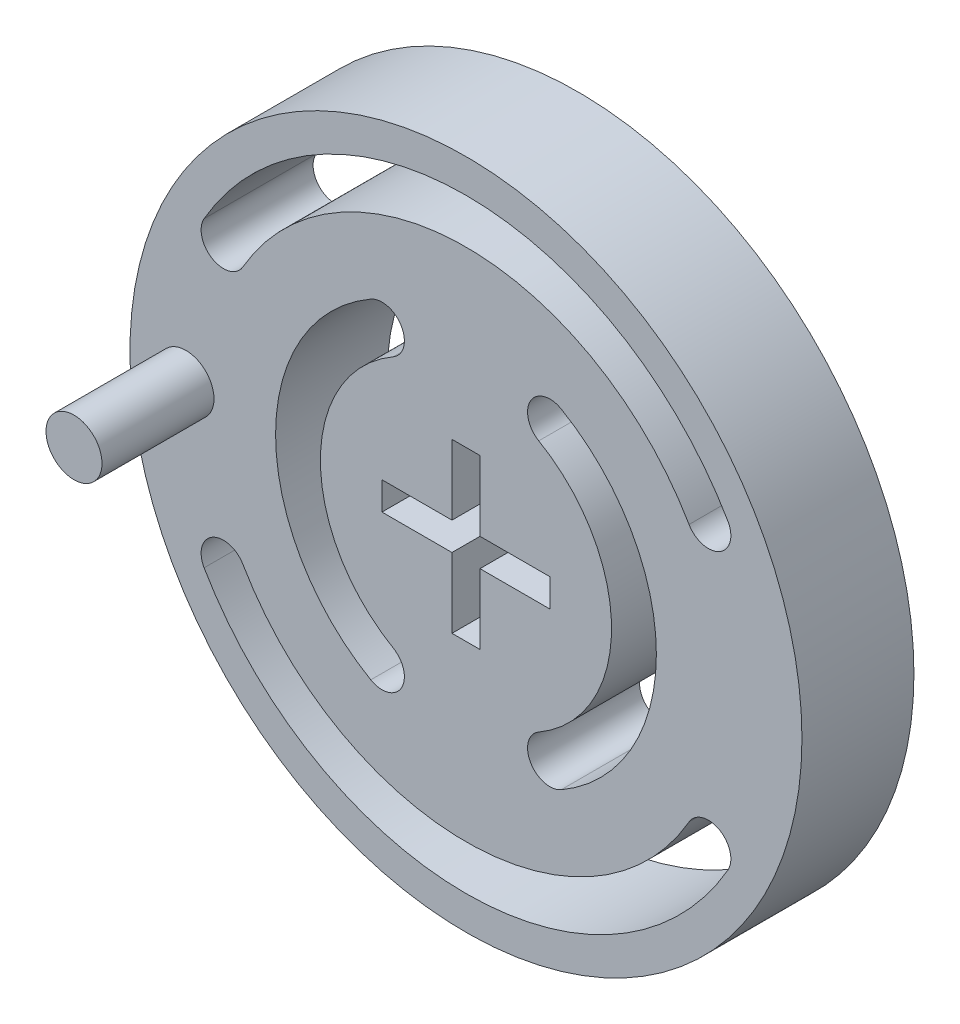
ISO-10303-21;
HEADER;
FILE_DESCRIPTION(('STEP AP214'),'2;1');
FILE_NAME('part.step','',(''),(''),'','','');
FILE_SCHEMA(('AUTOMOTIVE_DESIGN { 1 0 10303 214 1 1 1 1 }'));
ENDSEC;
DATA;
#1=APPLICATION_CONTEXT('core data for automotive mechanical design processes');
#2=APPLICATION_PROTOCOL_DEFINITION('international standard','automotive_design',2000,#1);
#3=PRODUCT_CONTEXT('',#1,'mechanical');
#4=PRODUCT('Part','Part','',(#3));
#5=PRODUCT_RELATED_PRODUCT_CATEGORY('part','',(#4));
#6=PRODUCT_DEFINITION_FORMATION('','',#4);
#7=PRODUCT_DEFINITION_CONTEXT('part definition',#1,'design');
#8=PRODUCT_DEFINITION('design','',#6,#7);
#9=PRODUCT_DEFINITION_SHAPE('','',#8);
#10=(LENGTH_UNIT() NAMED_UNIT(*) SI_UNIT(.MILLI.,.METRE.));
#11=(NAMED_UNIT(*) PLANE_ANGLE_UNIT() SI_UNIT($,.RADIAN.));
#12=(NAMED_UNIT(*) SI_UNIT($,.STERADIAN.) SOLID_ANGLE_UNIT());
#13=UNCERTAINTY_MEASURE_WITH_UNIT(LENGTH_MEASURE(1.E-05),#10,'distance_accuracy_value','');
#14=(GEOMETRIC_REPRESENTATION_CONTEXT(3) GLOBAL_UNCERTAINTY_ASSIGNED_CONTEXT((#13)) GLOBAL_UNIT_ASSIGNED_CONTEXT((#10,
#11,#12)) REPRESENTATION_CONTEXT('',''));
#15=CARTESIAN_POINT('',(0.,0.,0.));
#16=DIRECTION('',(0.,0.,1.));
#17=DIRECTION('',(1.,0.,0.));
#18=AXIS2_PLACEMENT_3D('',#15,#16,#17);
#19=CARTESIAN_POINT('',(0.,0.,10.));
#20=DIRECTION('',(0.,0.,-1.));
#21=DIRECTION('',(-1.,0.,0.));
#22=AXIS2_PLACEMENT_3D('',#19,#20,#21);
#23=CYLINDRICAL_SURFACE('',#22,30.);
#24=CARTESIAN_POINT('',(0.,0.,10.));
#25=DIRECTION('',(0.,0.,1.));
#26=DIRECTION('',(1.,0.,0.));
#27=AXIS2_PLACEMENT_3D('',#24,#25,#26);
#28=CIRCLE('',#27,30.);
#29=CARTESIAN_POINT('',(30.,0.,10.));
#30=VERTEX_POINT('',#29);
#31=EDGE_CURVE('E412',#30,#30,#28,.T.);
#32=ORIENTED_EDGE('',*,*,#31,.F.);
#33=EDGE_LOOP('',(#32));
#34=FACE_BOUND('',#33,.T.);
#35=CARTESIAN_POINT('',(0.,0.,0.));
#36=DIRECTION('',(0.,0.,1.));
#37=DIRECTION('',(1.,0.,0.));
#38=AXIS2_PLACEMENT_3D('',#35,#36,#37);
#39=CIRCLE('',#38,30.);
#40=CARTESIAN_POINT('',(30.,0.,0.));
#41=VERTEX_POINT('',#40);
#42=EDGE_CURVE('E409',#41,#41,#39,.T.);
#43=ORIENTED_EDGE('',*,*,#42,.T.);
#44=EDGE_LOOP('',(#43));
#45=FACE_BOUND('',#44,.T.);
#46=ADVANCED_FACE('F38',(#34,#45),#23,.T.);
#47=CARTESIAN_POINT('',(0.,0.,10.));
#48=DIRECTION('',(0.,0.,1.));
#49=DIRECTION('',(1.,0.,0.));
#50=AXIS2_PLACEMENT_3D('',#47,#48,#49);
#51=PLANE('',#50);
#52=CARTESIAN_POINT('',(-7.49999999999997,12.9903810567666,10.));
#53=DIRECTION('',(0.,0.,1.));
#54=DIRECTION('',(1.,0.,0.));
#55=AXIS2_PLACEMENT_3D('',#52,#53,#54);
#56=CIRCLE('',#55,2.);
#57=CARTESIAN_POINT('',(-6.49999999999997,11.2583302491977,10.));
#58=VERTEX_POINT('',#57);
#59=CARTESIAN_POINT('',(-8.49999999999997,14.7224318643355,10.));
#60=VERTEX_POINT('',#59);
#61=EDGE_CURVE('E52',#58,#60,#56,.T.);
#62=ORIENTED_EDGE('',*,*,#61,.F.);
#63=CARTESIAN_POINT('',(0.,0.,10.));
#64=DIRECTION('',(0.,0.,-1.));
#65=DIRECTION('',(1.,0.,0.));
#66=AXIS2_PLACEMENT_3D('',#63,#64,#65);
#67=CIRCLE('',#66,13.);
#68=CARTESIAN_POINT('',(-6.49999999999997,-11.2583302491977,10.));
#69=VERTEX_POINT('',#68);
#70=EDGE_CURVE('E266',#69,#58,#67,.T.);
#71=ORIENTED_EDGE('',*,*,#70,.F.);
#72=CARTESIAN_POINT('',(-7.49999999999996,-12.9903810567666,10.));
#73=DIRECTION('',(0.,0.,1.));
#74=DIRECTION('',(1.,0.,0.));
#75=AXIS2_PLACEMENT_3D('',#72,#73,#74);
#76=CIRCLE('',#75,2.);
#77=CARTESIAN_POINT('',(-8.49999999999996,-14.7224318643355,10.));
#78=VERTEX_POINT('',#77);
#79=EDGE_CURVE('E263',#78,#69,#76,.T.);
#80=ORIENTED_EDGE('',*,*,#79,.F.);
#81=CARTESIAN_POINT('',(0.,0.,10.));
#82=DIRECTION('',(0.,0.,1.));
#83=DIRECTION('',(1.,0.,0.));
#84=AXIS2_PLACEMENT_3D('',#81,#82,#83);
#85=CIRCLE('',#84,17.);
#86=EDGE_CURVE('E260',#60,#78,#85,.T.);
#87=ORIENTED_EDGE('',*,*,#86,.F.);
#88=EDGE_LOOP('',(#62,#71,#80,#87));
#89=FACE_BOUND('',#88,.T.);
#90=CARTESIAN_POINT('',(21.650635094611,-12.5,10.));
#91=DIRECTION('',(0.,0.,1.));
#92=DIRECTION('',(-1.,0.,0.));
#93=AXIS2_PLACEMENT_3D('',#90,#91,#92);
#94=CIRCLE('',#93,2.);
#95=CARTESIAN_POINT('',(23.3826859021799,-13.5,10.));
#96=VERTEX_POINT('',#95);
#97=CARTESIAN_POINT('',(19.9185842870421,-11.5,10.));
#98=VERTEX_POINT('',#97);
#99=EDGE_CURVE('E60',#96,#98,#94,.T.);
#100=ORIENTED_EDGE('',*,*,#99,.F.);
#101=CARTESIAN_POINT('',(0.,0.,10.));
#102=DIRECTION('',(0.,0.,1.));
#103=DIRECTION('',(-1.,0.,0.));
#104=AXIS2_PLACEMENT_3D('',#101,#102,#103);
#105=CIRCLE('',#104,27.);
#106=CARTESIAN_POINT('',(-23.3826859021799,-13.4999999999999,10.));
#107=VERTEX_POINT('',#106);
#108=EDGE_CURVE('E284',#107,#96,#105,.T.);
#109=ORIENTED_EDGE('',*,*,#108,.F.);
#110=CARTESIAN_POINT('',(-21.650635094611,-12.4999999999999,10.));
#111=DIRECTION('',(0.,0.,1.));
#112=DIRECTION('',(-1.,0.,0.));
#113=AXIS2_PLACEMENT_3D('',#110,#111,#112);
#114=CIRCLE('',#113,2.);
#115=CARTESIAN_POINT('',(-19.9185842870421,-11.5,10.));
#116=VERTEX_POINT('',#115);
#117=EDGE_CURVE('E281',#116,#107,#114,.T.);
#118=ORIENTED_EDGE('',*,*,#117,.F.);
#119=CARTESIAN_POINT('',(0.,0.,10.));
#120=DIRECTION('',(0.,0.,-1.));
#121=DIRECTION('',(-1.,0.,0.));
#122=AXIS2_PLACEMENT_3D('',#119,#120,#121);
#123=CIRCLE('',#122,23.);
#124=EDGE_CURVE('E278',#98,#116,#123,.T.);
#125=ORIENTED_EDGE('',*,*,#124,.F.);
#126=EDGE_LOOP('',(#100,#109,#118,#125));
#127=FACE_BOUND('',#126,.T.);
#128=CARTESIAN_POINT('',(7.49999999999997,12.9903810567666,10.));
#129=DIRECTION('',(0.,0.,1.));
#130=DIRECTION('',(-1.,0.,0.));
#131=AXIS2_PLACEMENT_3D('',#128,#129,#130);
#132=CIRCLE('',#131,2.);
#133=CARTESIAN_POINT('',(8.49999999999997,14.7224318643355,10.));
#134=VERTEX_POINT('',#133);
#135=CARTESIAN_POINT('',(6.49999999999998,11.2583302491977,10.));
#136=VERTEX_POINT('',#135);
#137=EDGE_CURVE('E245',#134,#136,#132,.T.);
#138=ORIENTED_EDGE('',*,*,#137,.F.);
#139=CARTESIAN_POINT('',(0.,0.,10.));
#140=DIRECTION('',(0.,0.,1.));
#141=DIRECTION('',(-1.,0.,0.));
#142=AXIS2_PLACEMENT_3D('',#139,#140,#141);
#143=CIRCLE('',#142,17.);
#144=CARTESIAN_POINT('',(8.49999999999996,-14.7224318643355,10.));
#145=VERTEX_POINT('',#144);
#146=EDGE_CURVE('E250',#145,#134,#143,.T.);
#147=ORIENTED_EDGE('',*,*,#146,.F.);
#148=CARTESIAN_POINT('',(7.49999999999996,-12.9903810567666,10.));
#149=DIRECTION('',(0.,0.,1.));
#150=DIRECTION('',(-1.,0.,0.));
#151=AXIS2_PLACEMENT_3D('',#148,#149,#150);
#152=CIRCLE('',#151,2.);
#153=CARTESIAN_POINT('',(6.49999999999997,-11.2583302491977,10.));
#154=VERTEX_POINT('',#153);
#155=EDGE_CURVE('E229',#154,#145,#152,.T.);
#156=ORIENTED_EDGE('',*,*,#155,.F.);
#157=CARTESIAN_POINT('',(0.,0.,10.));
#158=DIRECTION('',(0.,0.,-1.));
#159=DIRECTION('',(-1.,0.,0.));
#160=AXIS2_PLACEMENT_3D('',#157,#158,#159);
#161=CIRCLE('',#160,13.);
#162=EDGE_CURVE('E240',#136,#154,#161,.T.);
#163=ORIENTED_EDGE('',*,*,#162,.F.);
#164=EDGE_LOOP('',(#138,#147,#156,#163));
#165=FACE_BOUND('',#164,.T.);
#166=CARTESIAN_POINT('',(21.650635094611,12.5,10.));
#167=DIRECTION('',(0.,0.,1.));
#168=DIRECTION('',(1.,0.,0.));
#169=AXIS2_PLACEMENT_3D('',#166,#167,#168);
#170=CIRCLE('',#169,2.);
#171=CARTESIAN_POINT('',(19.9185842870421,11.5,10.));
#172=VERTEX_POINT('',#171);
#173=CARTESIAN_POINT('',(23.3826859021799,13.5,10.));
#174=VERTEX_POINT('',#173);
#175=EDGE_CURVE('E290',#172,#174,#170,.T.);
#176=ORIENTED_EDGE('',*,*,#175,.F.);
#177=CARTESIAN_POINT('',(0.,0.,10.));
#178=DIRECTION('',(0.,0.,-1.));
#179=DIRECTION('',(1.,0.,0.));
#180=AXIS2_PLACEMENT_3D('',#177,#178,#179);
#181=CIRCLE('',#180,23.);
#182=CARTESIAN_POINT('',(-19.9185842870421,11.5,10.));
#183=VERTEX_POINT('',#182);
#184=EDGE_CURVE('E303',#183,#172,#181,.T.);
#185=ORIENTED_EDGE('',*,*,#184,.F.);
#186=CARTESIAN_POINT('',(-21.650635094611,12.4999999999999,10.));
#187=DIRECTION('',(0.,0.,1.));
#188=DIRECTION('',(1.,0.,0.));
#189=AXIS2_PLACEMENT_3D('',#186,#187,#188);
#190=CIRCLE('',#189,2.);
#191=CARTESIAN_POINT('',(-23.3826859021799,13.4999999999999,10.));
#192=VERTEX_POINT('',#191);
#193=EDGE_CURVE('E300',#192,#183,#190,.T.);
#194=ORIENTED_EDGE('',*,*,#193,.F.);
#195=CARTESIAN_POINT('',(0.,0.,10.));
#196=DIRECTION('',(0.,0.,1.));
#197=DIRECTION('',(1.,0.,0.));
#198=AXIS2_PLACEMENT_3D('',#195,#196,#197);
#199=CIRCLE('',#198,27.);
#200=EDGE_CURVE('E297',#174,#192,#199,.T.);
#201=ORIENTED_EDGE('',*,*,#200,.F.);
#202=EDGE_LOOP('',(#176,#185,#194,#201));
#203=FACE_BOUND('',#202,.T.);
#204=DIRECTION('',(0.,-1.,0.));
#205=VECTOR('',#204,1.);
#206=CARTESIAN_POINT('',(-1.25,0.,10.));
#207=LINE('',#206,#205);
#208=CARTESIAN_POINT('',(-1.25,7.5,10.));
#209=VERTEX_POINT('',#208);
#210=CARTESIAN_POINT('',(-1.25,1.25,10.));
#211=VERTEX_POINT('',#210);
#212=EDGE_CURVE('E309',#209,#211,#207,.T.);
#213=ORIENTED_EDGE('',*,*,#212,.F.);
#214=DIRECTION('',(1.,0.,0.));
#215=VECTOR('',#214,1.);
#216=CARTESIAN_POINT('',(0.,7.5,10.));
#217=LINE('',#216,#215);
#218=CARTESIAN_POINT('',(1.25,7.5,10.));
#219=VERTEX_POINT('',#218);
#220=EDGE_CURVE('E320',#209,#219,#217,.T.);
#221=ORIENTED_EDGE('',*,*,#220,.T.);
#222=DIRECTION('',(0.,-1.,0.));
#223=VECTOR('',#222,1.);
#224=CARTESIAN_POINT('',(1.25,0.,10.));
#225=LINE('',#224,#223);
#226=CARTESIAN_POINT('',(1.25,1.25,10.));
#227=VERTEX_POINT('',#226);
#228=EDGE_CURVE('E376',#219,#227,#225,.T.);
#229=ORIENTED_EDGE('',*,*,#228,.T.);
#230=DIRECTION('',(1.,0.,0.));
#231=VECTOR('',#230,1.);
#232=CARTESIAN_POINT('',(0.,1.25,10.));
#233=LINE('',#232,#231);
#234=CARTESIAN_POINT('',(7.5,1.25,10.));
#235=VERTEX_POINT('',#234);
#236=EDGE_CURVE('E373',#227,#235,#233,.T.);
#237=ORIENTED_EDGE('',*,*,#236,.T.);
#238=DIRECTION('',(0.,-1.,0.));
#239=VECTOR('',#238,1.);
#240=CARTESIAN_POINT('',(7.5,0.,10.));
#241=LINE('',#240,#239);
#242=CARTESIAN_POINT('',(7.5,-1.25,10.));
#243=VERTEX_POINT('',#242);
#244=EDGE_CURVE('E370',#235,#243,#241,.T.);
#245=ORIENTED_EDGE('',*,*,#244,.T.);
#246=DIRECTION('',(1.,0.,0.));
#247=VECTOR('',#246,1.);
#248=CARTESIAN_POINT('',(0.,-1.25,10.));
#249=LINE('',#248,#247);
#250=CARTESIAN_POINT('',(1.25,-1.25,10.));
#251=VERTEX_POINT('',#250);
#252=EDGE_CURVE('E367',#251,#243,#249,.T.);
#253=ORIENTED_EDGE('',*,*,#252,.F.);
#254=DIRECTION('',(0.,-1.,0.));
#255=VECTOR('',#254,1.);
#256=CARTESIAN_POINT('',(1.25,0.,10.));
#257=LINE('',#256,#255);
#258=CARTESIAN_POINT('',(1.25,-7.5,10.));
#259=VERTEX_POINT('',#258);
#260=EDGE_CURVE('E364',#251,#259,#257,.T.);
#261=ORIENTED_EDGE('',*,*,#260,.T.);
#262=DIRECTION('',(1.,0.,0.));
#263=VECTOR('',#262,1.);
#264=CARTESIAN_POINT('',(0.,-7.5,10.));
#265=LINE('',#264,#263);
#266=CARTESIAN_POINT('',(-1.25,-7.5,10.));
#267=VERTEX_POINT('',#266);
#268=EDGE_CURVE('E361',#267,#259,#265,.T.);
#269=ORIENTED_EDGE('',*,*,#268,.F.);
#270=DIRECTION('',(0.,-1.,0.));
#271=VECTOR('',#270,1.);
#272=CARTESIAN_POINT('',(-1.25,0.,10.));
#273=LINE('',#272,#271);
#274=CARTESIAN_POINT('',(-1.25,-1.25,10.));
#275=VERTEX_POINT('',#274);
#276=EDGE_CURVE('E358',#275,#267,#273,.T.);
#277=ORIENTED_EDGE('',*,*,#276,.F.);
#278=DIRECTION('',(1.,0.,0.));
#279=VECTOR('',#278,1.);
#280=CARTESIAN_POINT('',(0.,-1.25,10.));
#281=LINE('',#280,#279);
#282=CARTESIAN_POINT('',(-7.5,-1.25,10.));
#283=VERTEX_POINT('',#282);
#284=EDGE_CURVE('E355',#283,#275,#281,.T.);
#285=ORIENTED_EDGE('',*,*,#284,.F.);
#286=DIRECTION('',(0.,-1.,0.));
#287=VECTOR('',#286,1.);
#288=CARTESIAN_POINT('',(-7.5,0.,10.));
#289=LINE('',#288,#287);
#290=CARTESIAN_POINT('',(-7.5,1.25,10.));
#291=VERTEX_POINT('',#290);
#292=EDGE_CURVE('E352',#291,#283,#289,.T.);
#293=ORIENTED_EDGE('',*,*,#292,.F.);
#294=DIRECTION('',(1.,0.,0.));
#295=VECTOR('',#294,1.);
#296=CARTESIAN_POINT('',(0.,1.25,10.));
#297=LINE('',#296,#295);
#298=EDGE_CURVE('E349',#291,#211,#297,.T.);
#299=ORIENTED_EDGE('',*,*,#298,.T.);
#300=EDGE_LOOP('',(#213,#221,#229,#237,#245,#253,#261,#269,#277,#285,#293,#299));
#301=FACE_BOUND('',#300,.T.);
#302=CARTESIAN_POINT('',(-25.,0.,10.));
#303=DIRECTION('',(0.,0.,1.));
#304=DIRECTION('',(1.,0.,0.));
#305=AXIS2_PLACEMENT_3D('',#302,#303,#304);
#306=CIRCLE('',#305,2.49999999999999);
#307=CARTESIAN_POINT('',(-22.5,0.,10.));
#308=VERTEX_POINT('',#307);
#309=EDGE_CURVE('E383',#308,#308,#306,.T.);
#310=ORIENTED_EDGE('',*,*,#309,.F.);
#311=EDGE_LOOP('',(#310));
#312=FACE_BOUND('',#311,.T.);
#313=ORIENTED_EDGE('',*,*,#31,.T.);
#314=EDGE_LOOP('',(#313));
#315=FACE_BOUND('',#314,.T.);
#316=ADVANCED_FACE('F247',(#89,#127,#165,#203,#301,#312,#315),#51,.T.);
#317=CARTESIAN_POINT('',(0.,0.,0.));
#318=DIRECTION('',(0.,0.,1.));
#319=DIRECTION('',(1.,0.,0.));
#320=AXIS2_PLACEMENT_3D('',#317,#318,#319);
#321=PLANE('',#320);
#322=CARTESIAN_POINT('',(0.,0.,0.));
#323=DIRECTION('',(0.,0.,1.));
#324=DIRECTION('',(1.,0.,0.));
#325=AXIS2_PLACEMENT_3D('',#322,#323,#324);
#326=CIRCLE('',#325,13.);
#327=CARTESIAN_POINT('',(-6.49999999999997,-11.2583302491977,0.));
#328=VERTEX_POINT('',#327);
#329=CARTESIAN_POINT('',(-6.49999999999997,11.2583302491977,0.));
#330=VERTEX_POINT('',#329);
#331=EDGE_CURVE('E45',#328,#330,#326,.F.);
#332=ORIENTED_EDGE('',*,*,#331,.T.);
#333=CARTESIAN_POINT('',(-7.49999999999997,12.9903810567666,0.));
#334=DIRECTION('',(0.,0.,1.));
#335=DIRECTION('',(1.,0.,0.));
#336=AXIS2_PLACEMENT_3D('',#333,#334,#335);
#337=CIRCLE('',#336,2.);
#338=CARTESIAN_POINT('',(-8.49999999999997,14.7224318643355,0.));
#339=VERTEX_POINT('',#338);
#340=EDGE_CURVE('E11',#330,#339,#337,.T.);
#341=ORIENTED_EDGE('',*,*,#340,.T.);
#342=CARTESIAN_POINT('',(0.,0.,0.));
#343=DIRECTION('',(0.,0.,1.));
#344=DIRECTION('',(1.,0.,0.));
#345=AXIS2_PLACEMENT_3D('',#342,#343,#344);
#346=CIRCLE('',#345,17.);
#347=CARTESIAN_POINT('',(-8.49999999999996,-14.7224318643355,0.));
#348=VERTEX_POINT('',#347);
#349=EDGE_CURVE('E450',#339,#348,#346,.T.);
#350=ORIENTED_EDGE('',*,*,#349,.T.);
#351=CARTESIAN_POINT('',(-7.49999999999996,-12.9903810567666,0.));
#352=DIRECTION('',(0.,0.,1.));
#353=DIRECTION('',(1.,0.,0.));
#354=AXIS2_PLACEMENT_3D('',#351,#352,#353);
#355=CIRCLE('',#354,2.);
#356=EDGE_CURVE('E453',#348,#328,#355,.T.);
#357=ORIENTED_EDGE('',*,*,#356,.T.);
#358=EDGE_LOOP('',(#332,#341,#350,#357));
#359=FACE_BOUND('',#358,.T.);
#360=CARTESIAN_POINT('',(0.,0.,0.));
#361=DIRECTION('',(0.,0.,1.));
#362=DIRECTION('',(1.,0.,0.));
#363=AXIS2_PLACEMENT_3D('',#360,#361,#362);
#364=CIRCLE('',#363,27.);
#365=CARTESIAN_POINT('',(-23.3826859021799,-13.4999999999999,0.));
#366=VERTEX_POINT('',#365);
#367=CARTESIAN_POINT('',(23.3826859021799,-13.5,0.));
#368=VERTEX_POINT('',#367);
#369=EDGE_CURVE('E444',#366,#368,#364,.T.);
#370=ORIENTED_EDGE('',*,*,#369,.T.);
#371=CARTESIAN_POINT('',(21.650635094611,-12.5,0.));
#372=DIRECTION('',(0.,0.,1.));
#373=DIRECTION('',(1.,0.,0.));
#374=AXIS2_PLACEMENT_3D('',#371,#372,#373);
#375=CIRCLE('',#374,2.);
#376=CARTESIAN_POINT('',(19.9185842870421,-11.5,0.));
#377=VERTEX_POINT('',#376);
#378=EDGE_CURVE('E447',#368,#377,#375,.T.);
#379=ORIENTED_EDGE('',*,*,#378,.T.);
#380=CARTESIAN_POINT('',(0.,0.,0.));
#381=DIRECTION('',(0.,0.,1.));
#382=DIRECTION('',(1.,0.,0.));
#383=AXIS2_PLACEMENT_3D('',#380,#381,#382);
#384=CIRCLE('',#383,23.);
#385=CARTESIAN_POINT('',(-19.9185842870421,-11.4999999999999,0.));
#386=VERTEX_POINT('',#385);
#387=EDGE_CURVE('E438',#377,#386,#384,.F.);
#388=ORIENTED_EDGE('',*,*,#387,.T.);
#389=CARTESIAN_POINT('',(-21.650635094611,-12.4999999999999,0.));
#390=DIRECTION('',(0.,0.,1.));
#391=DIRECTION('',(1.,0.,0.));
#392=AXIS2_PLACEMENT_3D('',#389,#390,#391);
#393=CIRCLE('',#392,2.);
#394=EDGE_CURVE('E441',#386,#366,#393,.T.);
#395=ORIENTED_EDGE('',*,*,#394,.T.);
#396=EDGE_LOOP('',(#370,#379,#388,#395));
#397=FACE_BOUND('',#396,.T.);
#398=CARTESIAN_POINT('',(0.,0.,0.));
#399=DIRECTION('',(0.,0.,1.));
#400=DIRECTION('',(1.,0.,0.));
#401=AXIS2_PLACEMENT_3D('',#398,#399,#400);
#402=CIRCLE('',#401,17.);
#403=CARTESIAN_POINT('',(8.49999999999996,-14.7224318643355,0.));
#404=VERTEX_POINT('',#403);
#405=CARTESIAN_POINT('',(8.49999999999997,14.7224318643355,0.));
#406=VERTEX_POINT('',#405);
#407=EDGE_CURVE('E432',#404,#406,#402,.T.);
#408=ORIENTED_EDGE('',*,*,#407,.T.);
#409=CARTESIAN_POINT('',(7.49999999999997,12.9903810567666,0.));
#410=DIRECTION('',(0.,0.,1.));
#411=DIRECTION('',(1.,0.,0.));
#412=AXIS2_PLACEMENT_3D('',#409,#410,#411);
#413=CIRCLE('',#412,2.);
#414=CARTESIAN_POINT('',(6.49999999999998,11.2583302491977,0.));
#415=VERTEX_POINT('',#414);
#416=EDGE_CURVE('E435',#406,#415,#413,.T.);
#417=ORIENTED_EDGE('',*,*,#416,.T.);
#418=CARTESIAN_POINT('',(0.,0.,0.));
#419=DIRECTION('',(0.,0.,1.));
#420=DIRECTION('',(1.,0.,0.));
#421=AXIS2_PLACEMENT_3D('',#418,#419,#420);
#422=CIRCLE('',#421,13.);
#423=CARTESIAN_POINT('',(6.49999999999997,-11.2583302491977,0.));
#424=VERTEX_POINT('',#423);
#425=EDGE_CURVE('E429',#415,#424,#422,.F.);
#426=ORIENTED_EDGE('',*,*,#425,.T.);
#427=CARTESIAN_POINT('',(7.49999999999996,-12.9903810567666,0.));
#428=DIRECTION('',(0.,0.,1.));
#429=DIRECTION('',(1.,0.,0.));
#430=AXIS2_PLACEMENT_3D('',#427,#428,#429);
#431=CIRCLE('',#430,2.);
#432=EDGE_CURVE('E232',#424,#404,#431,.T.);
#433=ORIENTED_EDGE('',*,*,#432,.T.);
#434=EDGE_LOOP('',(#408,#417,#426,#433));
#435=FACE_BOUND('',#434,.T.);
#436=CARTESIAN_POINT('',(0.,0.,0.));
#437=DIRECTION('',(0.,0.,1.));
#438=DIRECTION('',(1.,0.,0.));
#439=AXIS2_PLACEMENT_3D('',#436,#437,#438);
#440=CIRCLE('',#439,23.);
#441=CARTESIAN_POINT('',(-19.9185842870421,11.5,0.));
#442=VERTEX_POINT('',#441);
#443=CARTESIAN_POINT('',(19.9185842870421,11.5,0.));
#444=VERTEX_POINT('',#443);
#445=EDGE_CURVE('E423',#442,#444,#440,.F.);
#446=ORIENTED_EDGE('',*,*,#445,.T.);
#447=CARTESIAN_POINT('',(21.650635094611,12.5,0.));
#448=DIRECTION('',(0.,0.,1.));
#449=DIRECTION('',(1.,0.,0.));
#450=AXIS2_PLACEMENT_3D('',#447,#448,#449);
#451=CIRCLE('',#450,2.);
#452=CARTESIAN_POINT('',(23.3826859021799,13.5,0.));
#453=VERTEX_POINT('',#452);
#454=EDGE_CURVE('E426',#444,#453,#451,.T.);
#455=ORIENTED_EDGE('',*,*,#454,.T.);
#456=CARTESIAN_POINT('',(0.,0.,0.));
#457=DIRECTION('',(0.,0.,1.));
#458=DIRECTION('',(1.,0.,0.));
#459=AXIS2_PLACEMENT_3D('',#456,#457,#458);
#460=CIRCLE('',#459,27.);
#461=CARTESIAN_POINT('',(-23.3826859021799,13.4999999999999,0.));
#462=VERTEX_POINT('',#461);
#463=EDGE_CURVE('E415',#453,#462,#460,.T.);
#464=ORIENTED_EDGE('',*,*,#463,.T.);
#465=CARTESIAN_POINT('',(-21.650635094611,12.4999999999999,0.));
#466=DIRECTION('',(0.,0.,1.));
#467=DIRECTION('',(1.,0.,0.));
#468=AXIS2_PLACEMENT_3D('',#465,#466,#467);
#469=CIRCLE('',#468,2.);
#470=EDGE_CURVE('E420',#462,#442,#469,.T.);
#471=ORIENTED_EDGE('',*,*,#470,.T.);
#472=EDGE_LOOP('',(#446,#455,#464,#471));
#473=FACE_BOUND('',#472,.T.);
#474=DIRECTION('',(1.,0.,0.));
#475=VECTOR('',#474,1.);
#476=CARTESIAN_POINT('',(0.,7.5,0.));
#477=LINE('',#476,#475);
#478=CARTESIAN_POINT('',(-1.25,7.5,0.));
#479=VERTEX_POINT('',#478);
#480=CARTESIAN_POINT('',(1.25,7.5,0.));
#481=VERTEX_POINT('',#480);
#482=EDGE_CURVE('E345',#479,#481,#477,.T.);
#483=ORIENTED_EDGE('',*,*,#482,.F.);
#484=DIRECTION('',(0.,-1.,0.));
#485=VECTOR('',#484,1.);
#486=CARTESIAN_POINT('',(-1.25,0.,0.));
#487=LINE('',#486,#485);
#488=CARTESIAN_POINT('',(-1.25,1.25,0.));
#489=VERTEX_POINT('',#488);
#490=EDGE_CURVE('E316',#479,#489,#487,.T.);
#491=ORIENTED_EDGE('',*,*,#490,.T.);
#492=DIRECTION('',(1.,0.,0.));
#493=VECTOR('',#492,1.);
#494=CARTESIAN_POINT('',(0.,1.25,0.));
#495=LINE('',#494,#493);
#496=CARTESIAN_POINT('',(-7.5,1.25,0.));
#497=VERTEX_POINT('',#496);
#498=EDGE_CURVE('E319',#497,#489,#495,.T.);
#499=ORIENTED_EDGE('',*,*,#498,.F.);
#500=DIRECTION('',(0.,-1.,0.));
#501=VECTOR('',#500,1.);
#502=CARTESIAN_POINT('',(-7.5,0.,0.));
#503=LINE('',#502,#501);
#504=CARTESIAN_POINT('',(-7.5,-1.25,0.));
#505=VERTEX_POINT('',#504);
#506=EDGE_CURVE('E322',#497,#505,#503,.T.);
#507=ORIENTED_EDGE('',*,*,#506,.T.);
#508=DIRECTION('',(1.,0.,0.));
#509=VECTOR('',#508,1.);
#510=CARTESIAN_POINT('',(0.,-1.25,0.));
#511=LINE('',#510,#509);
#512=CARTESIAN_POINT('',(-1.25,-1.25,0.));
#513=VERTEX_POINT('',#512);
#514=EDGE_CURVE('E325',#505,#513,#511,.T.);
#515=ORIENTED_EDGE('',*,*,#514,.T.);
#516=DIRECTION('',(0.,-1.,0.));
#517=VECTOR('',#516,1.);
#518=CARTESIAN_POINT('',(-1.25,0.,0.));
#519=LINE('',#518,#517);
#520=CARTESIAN_POINT('',(-1.25,-7.5,0.));
#521=VERTEX_POINT('',#520);
#522=EDGE_CURVE('E328',#513,#521,#519,.T.);
#523=ORIENTED_EDGE('',*,*,#522,.T.);
#524=DIRECTION('',(1.,0.,0.));
#525=VECTOR('',#524,1.);
#526=CARTESIAN_POINT('',(0.,-7.5,0.));
#527=LINE('',#526,#525);
#528=CARTESIAN_POINT('',(1.25,-7.5,0.));
#529=VERTEX_POINT('',#528);
#530=EDGE_CURVE('E331',#521,#529,#527,.T.);
#531=ORIENTED_EDGE('',*,*,#530,.T.);
#532=DIRECTION('',(0.,-1.,0.));
#533=VECTOR('',#532,1.);
#534=CARTESIAN_POINT('',(1.25,0.,0.));
#535=LINE('',#534,#533);
#536=CARTESIAN_POINT('',(1.25,-1.25,0.));
#537=VERTEX_POINT('',#536);
#538=EDGE_CURVE('E334',#537,#529,#535,.T.);
#539=ORIENTED_EDGE('',*,*,#538,.F.);
#540=DIRECTION('',(1.,0.,0.));
#541=VECTOR('',#540,1.);
#542=CARTESIAN_POINT('',(0.,-1.25,0.));
#543=LINE('',#542,#541);
#544=CARTESIAN_POINT('',(7.5,-1.25,0.));
#545=VERTEX_POINT('',#544);
#546=EDGE_CURVE('E336',#537,#545,#543,.T.);
#547=ORIENTED_EDGE('',*,*,#546,.T.);
#548=DIRECTION('',(0.,-1.,0.));
#549=VECTOR('',#548,1.);
#550=CARTESIAN_POINT('',(7.5,0.,0.));
#551=LINE('',#550,#549);
#552=CARTESIAN_POINT('',(7.5,1.25,0.));
#553=VERTEX_POINT('',#552);
#554=EDGE_CURVE('E339',#553,#545,#551,.T.);
#555=ORIENTED_EDGE('',*,*,#554,.F.);
#556=DIRECTION('',(1.,0.,0.));
#557=VECTOR('',#556,1.);
#558=CARTESIAN_POINT('',(0.,1.25,0.));
#559=LINE('',#558,#557);
#560=CARTESIAN_POINT('',(1.25,1.25,0.));
#561=VERTEX_POINT('',#560);
#562=EDGE_CURVE('E341',#561,#553,#559,.T.);
#563=ORIENTED_EDGE('',*,*,#562,.F.);
#564=DIRECTION('',(0.,-1.,0.));
#565=VECTOR('',#564,1.);
#566=CARTESIAN_POINT('',(1.25,0.,0.));
#567=LINE('',#566,#565);
#568=EDGE_CURVE('E343',#481,#561,#567,.T.);
#569=ORIENTED_EDGE('',*,*,#568,.F.);
#570=EDGE_LOOP('',(#483,#491,#499,#507,#515,#523,#531,#539,#547,#555,#563,#569));
#571=FACE_BOUND('',#570,.T.);
#572=ORIENTED_EDGE('',*,*,#42,.F.);
#573=EDGE_LOOP('',(#572));
#574=FACE_BOUND('',#573,.T.);
#575=ADVANCED_FACE('F457',(#359,#397,#435,#473,#571,#574),#321,.F.);
#576=CARTESIAN_POINT('',(-25.,0.,20.));
#577=DIRECTION('',(0.,0.,-1.));
#578=DIRECTION('',(-1.,0.,0.));
#579=AXIS2_PLACEMENT_3D('',#576,#577,#578);
#580=CYLINDRICAL_SURFACE('',#579,2.49999999999999);
#581=CARTESIAN_POINT('',(-25.,0.,20.));
#582=DIRECTION('',(0.,0.,1.));
#583=DIRECTION('',(1.,0.,0.));
#584=AXIS2_PLACEMENT_3D('',#581,#582,#583);
#585=CIRCLE('',#584,2.49999999999999);
#586=CARTESIAN_POINT('',(-22.5,0.,20.));
#587=VERTEX_POINT('',#586);
#588=EDGE_CURVE('E406',#587,#587,#585,.T.);
#589=ORIENTED_EDGE('',*,*,#588,.F.);
#590=EDGE_LOOP('',(#589));
#591=FACE_BOUND('',#590,.T.);
#592=ORIENTED_EDGE('',*,*,#309,.T.);
#593=EDGE_LOOP('',(#592));
#594=FACE_BOUND('',#593,.T.);
#595=ADVANCED_FACE('F498',(#591,#594),#580,.T.);
#596=CARTESIAN_POINT('',(-25.,0.,20.));
#597=DIRECTION('',(0.,0.,1.));
#598=DIRECTION('',(1.,0.,0.));
#599=AXIS2_PLACEMENT_3D('',#596,#597,#598);
#600=PLANE('',#599);
#601=ORIENTED_EDGE('',*,*,#588,.T.);
#602=EDGE_LOOP('',(#601));
#603=FACE_BOUND('',#602,.T.);
#604=ADVANCED_FACE('F502',(#603),#600,.T.);
#605=CARTESIAN_POINT('',(-1.25,0.,0.));
#606=DIRECTION('',(-1.,0.,0.));
#607=DIRECTION('',(0.,0.,1.));
#608=AXIS2_PLACEMENT_3D('',#605,#606,#607);
#609=PLANE('',#608);
#610=ORIENTED_EDGE('',*,*,#212,.T.);
#611=DIRECTION('',(0.,0.,1.));
#612=VECTOR('',#611,1.);
#613=CARTESIAN_POINT('',(-1.25,1.25,0.));
#614=LINE('',#613,#612);
#615=EDGE_CURVE('E347',#489,#211,#614,.T.);
#616=ORIENTED_EDGE('',*,*,#615,.F.);
#617=ORIENTED_EDGE('',*,*,#490,.F.);
#618=DIRECTION('',(0.,0.,1.));
#619=VECTOR('',#618,1.);
#620=CARTESIAN_POINT('',(-1.25,7.5,0.));
#621=LINE('',#620,#619);
#622=EDGE_CURVE('E381',#479,#209,#621,.T.);
#623=ORIENTED_EDGE('',*,*,#622,.T.);
#624=EDGE_LOOP('',(#610,#616,#617,#623));
#625=FACE_BOUND('',#624,.T.);
#626=ADVANCED_FACE('F508',(#625),#609,.F.);
#627=CARTESIAN_POINT('',(0.,7.5,0.));
#628=DIRECTION('',(0.,-1.,0.));
#629=DIRECTION('',(0.,0.,-1.));
#630=AXIS2_PLACEMENT_3D('',#627,#628,#629);
#631=PLANE('',#630);
#632=ORIENTED_EDGE('',*,*,#220,.F.);
#633=ORIENTED_EDGE('',*,*,#622,.F.);
#634=ORIENTED_EDGE('',*,*,#482,.T.);
#635=DIRECTION('',(0.,0.,1.));
#636=VECTOR('',#635,1.);
#637=CARTESIAN_POINT('',(1.25,7.5,0.));
#638=LINE('',#637,#636);
#639=EDGE_CURVE('E384',#481,#219,#638,.T.);
#640=ORIENTED_EDGE('',*,*,#639,.T.);
#641=EDGE_LOOP('',(#632,#633,#634,#640));
#642=FACE_BOUND('',#641,.T.);
#643=ADVANCED_FACE('F512',(#642),#631,.T.);
#644=CARTESIAN_POINT('',(1.25,0.,0.));
#645=DIRECTION('',(-1.,0.,0.));
#646=DIRECTION('',(0.,0.,1.));
#647=AXIS2_PLACEMENT_3D('',#644,#645,#646);
#648=PLANE('',#647);
#649=ORIENTED_EDGE('',*,*,#228,.F.);
#650=ORIENTED_EDGE('',*,*,#639,.F.);
#651=ORIENTED_EDGE('',*,*,#568,.T.);
#652=DIRECTION('',(0.,0.,1.));
#653=VECTOR('',#652,1.);
#654=CARTESIAN_POINT('',(1.25,1.25,0.));
#655=LINE('',#654,#653);
#656=EDGE_CURVE('E386',#561,#227,#655,.T.);
#657=ORIENTED_EDGE('',*,*,#656,.T.);
#658=EDGE_LOOP('',(#649,#650,#651,#657));
#659=FACE_BOUND('',#658,.T.);
#660=ADVANCED_FACE('F550',(#659),#648,.T.);
#661=CARTESIAN_POINT('',(0.,1.25,0.));
#662=DIRECTION('',(0.,-1.,0.));
#663=DIRECTION('',(1.,0.,0.));
#664=AXIS2_PLACEMENT_3D('',#661,#662,#663);
#665=PLANE('',#664);
#666=ORIENTED_EDGE('',*,*,#236,.F.);
#667=ORIENTED_EDGE('',*,*,#656,.F.);
#668=ORIENTED_EDGE('',*,*,#562,.T.);
#669=DIRECTION('',(0.,0.,1.));
#670=VECTOR('',#669,1.);
#671=CARTESIAN_POINT('',(7.5,1.25,0.));
#672=LINE('',#671,#670);
#673=EDGE_CURVE('E388',#553,#235,#672,.T.);
#674=ORIENTED_EDGE('',*,*,#673,.T.);
#675=EDGE_LOOP('',(#666,#667,#668,#674));
#676=FACE_BOUND('',#675,.T.);
#677=ADVANCED_FACE('F546',(#676),#665,.T.);
#678=CARTESIAN_POINT('',(7.5,0.,0.));
#679=DIRECTION('',(-1.,0.,0.));
#680=DIRECTION('',(0.,0.,1.));
#681=AXIS2_PLACEMENT_3D('',#678,#679,#680);
#682=PLANE('',#681);
#683=ORIENTED_EDGE('',*,*,#244,.F.);
#684=ORIENTED_EDGE('',*,*,#673,.F.);
#685=ORIENTED_EDGE('',*,*,#554,.T.);
#686=DIRECTION('',(0.,0.,1.));
#687=VECTOR('',#686,1.);
#688=CARTESIAN_POINT('',(7.5,-1.25,0.));
#689=LINE('',#688,#687);
#690=EDGE_CURVE('E390',#545,#243,#689,.T.);
#691=ORIENTED_EDGE('',*,*,#690,.T.);
#692=EDGE_LOOP('',(#683,#684,#685,#691));
#693=FACE_BOUND('',#692,.T.);
#694=ADVANCED_FACE('F542',(#693),#682,.T.);
#695=CARTESIAN_POINT('',(0.,-1.25,0.));
#696=DIRECTION('',(0.,-1.,0.));
#697=DIRECTION('',(1.,0.,0.));
#698=AXIS2_PLACEMENT_3D('',#695,#696,#697);
#699=PLANE('',#698);
#700=ORIENTED_EDGE('',*,*,#252,.T.);
#701=ORIENTED_EDGE('',*,*,#690,.F.);
#702=ORIENTED_EDGE('',*,*,#546,.F.);
#703=DIRECTION('',(0.,0.,1.));
#704=VECTOR('',#703,1.);
#705=CARTESIAN_POINT('',(1.25,-1.25,0.));
#706=LINE('',#705,#704);
#707=EDGE_CURVE('E392',#537,#251,#706,.T.);
#708=ORIENTED_EDGE('',*,*,#707,.T.);
#709=EDGE_LOOP('',(#700,#701,#702,#708));
#710=FACE_BOUND('',#709,.T.);
#711=ADVANCED_FACE('F538',(#710),#699,.F.);
#712=CARTESIAN_POINT('',(1.25,0.,0.));
#713=DIRECTION('',(-1.,0.,0.));
#714=DIRECTION('',(0.,0.,1.));
#715=AXIS2_PLACEMENT_3D('',#712,#713,#714);
#716=PLANE('',#715);
#717=ORIENTED_EDGE('',*,*,#260,.F.);
#718=ORIENTED_EDGE('',*,*,#707,.F.);
#719=ORIENTED_EDGE('',*,*,#538,.T.);
#720=DIRECTION('',(0.,0.,1.));
#721=VECTOR('',#720,1.);
#722=CARTESIAN_POINT('',(1.25,-7.5,0.));
#723=LINE('',#722,#721);
#724=EDGE_CURVE('E394',#529,#259,#723,.T.);
#725=ORIENTED_EDGE('',*,*,#724,.T.);
#726=EDGE_LOOP('',(#717,#718,#719,#725));
#727=FACE_BOUND('',#726,.T.);
#728=ADVANCED_FACE('F534',(#727),#716,.T.);
#729=CARTESIAN_POINT('',(0.,-7.5,0.));
#730=DIRECTION('',(0.,-1.,0.));
#731=DIRECTION('',(0.,0.,-1.));
#732=AXIS2_PLACEMENT_3D('',#729,#730,#731);
#733=PLANE('',#732);
#734=ORIENTED_EDGE('',*,*,#268,.T.);
#735=ORIENTED_EDGE('',*,*,#724,.F.);
#736=ORIENTED_EDGE('',*,*,#530,.F.);
#737=DIRECTION('',(0.,0.,1.));
#738=VECTOR('',#737,1.);
#739=CARTESIAN_POINT('',(-1.25,-7.5,0.));
#740=LINE('',#739,#738);
#741=EDGE_CURVE('E396',#521,#267,#740,.T.);
#742=ORIENTED_EDGE('',*,*,#741,.T.);
#743=EDGE_LOOP('',(#734,#735,#736,#742));
#744=FACE_BOUND('',#743,.T.);
#745=ADVANCED_FACE('F530',(#744),#733,.F.);
#746=CARTESIAN_POINT('',(-1.25,0.,0.));
#747=DIRECTION('',(-1.,0.,0.));
#748=DIRECTION('',(0.,0.,1.));
#749=AXIS2_PLACEMENT_3D('',#746,#747,#748);
#750=PLANE('',#749);
#751=ORIENTED_EDGE('',*,*,#276,.T.);
#752=ORIENTED_EDGE('',*,*,#741,.F.);
#753=ORIENTED_EDGE('',*,*,#522,.F.);
#754=DIRECTION('',(0.,0.,1.));
#755=VECTOR('',#754,1.);
#756=CARTESIAN_POINT('',(-1.25,-1.25,0.));
#757=LINE('',#756,#755);
#758=EDGE_CURVE('E398',#513,#275,#757,.T.);
#759=ORIENTED_EDGE('',*,*,#758,.T.);
#760=EDGE_LOOP('',(#751,#752,#753,#759));
#761=FACE_BOUND('',#760,.T.);
#762=ADVANCED_FACE('F526',(#761),#750,.F.);
#763=CARTESIAN_POINT('',(0.,-1.25,0.));
#764=DIRECTION('',(0.,-1.,0.));
#765=DIRECTION('',(1.,0.,0.));
#766=AXIS2_PLACEMENT_3D('',#763,#764,#765);
#767=PLANE('',#766);
#768=ORIENTED_EDGE('',*,*,#284,.T.);
#769=ORIENTED_EDGE('',*,*,#758,.F.);
#770=ORIENTED_EDGE('',*,*,#514,.F.);
#771=DIRECTION('',(0.,0.,1.));
#772=VECTOR('',#771,1.);
#773=CARTESIAN_POINT('',(-7.5,-1.25,0.));
#774=LINE('',#773,#772);
#775=EDGE_CURVE('E400',#505,#283,#774,.T.);
#776=ORIENTED_EDGE('',*,*,#775,.T.);
#777=EDGE_LOOP('',(#768,#769,#770,#776));
#778=FACE_BOUND('',#777,.T.);
#779=ADVANCED_FACE('F522',(#778),#767,.F.);
#780=CARTESIAN_POINT('',(-7.5,0.,0.));
#781=DIRECTION('',(-1.,0.,0.));
#782=DIRECTION('',(0.,0.,1.));
#783=AXIS2_PLACEMENT_3D('',#780,#781,#782);
#784=PLANE('',#783);
#785=ORIENTED_EDGE('',*,*,#292,.T.);
#786=ORIENTED_EDGE('',*,*,#775,.F.);
#787=ORIENTED_EDGE('',*,*,#506,.F.);
#788=DIRECTION('',(0.,0.,1.));
#789=VECTOR('',#788,1.);
#790=CARTESIAN_POINT('',(-7.5,1.25,0.));
#791=LINE('',#790,#789);
#792=EDGE_CURVE('E402',#497,#291,#791,.T.);
#793=ORIENTED_EDGE('',*,*,#792,.T.);
#794=EDGE_LOOP('',(#785,#786,#787,#793));
#795=FACE_BOUND('',#794,.T.);
#796=ADVANCED_FACE('F518',(#795),#784,.F.);
#797=CARTESIAN_POINT('',(0.,1.25,0.));
#798=DIRECTION('',(0.,-1.,0.));
#799=DIRECTION('',(1.,0.,0.));
#800=AXIS2_PLACEMENT_3D('',#797,#798,#799);
#801=PLANE('',#800);
#802=ORIENTED_EDGE('',*,*,#298,.F.);
#803=ORIENTED_EDGE('',*,*,#792,.F.);
#804=ORIENTED_EDGE('',*,*,#498,.T.);
#805=ORIENTED_EDGE('',*,*,#615,.T.);
#806=EDGE_LOOP('',(#802,#803,#804,#805));
#807=FACE_BOUND('',#806,.T.);
#808=ADVANCED_FACE('F514',(#807),#801,.T.);
#809=CARTESIAN_POINT('',(21.650635094611,12.5,-10.));
#810=DIRECTION('',(0.,0.,1.));
#811=DIRECTION('',(1.,0.,0.));
#812=AXIS2_PLACEMENT_3D('',#809,#810,#811);
#813=CYLINDRICAL_SURFACE('',#812,2.);
#814=DIRECTION('',(0.,0.,1.));
#815=VECTOR('',#814,1.);
#816=CARTESIAN_POINT('',(19.9185842870421,11.5,-10.));
#817=LINE('',#816,#815);
#818=EDGE_CURVE('E307',#444,#172,#817,.T.);
#819=ORIENTED_EDGE('',*,*,#818,.T.);
#820=ORIENTED_EDGE('',*,*,#175,.T.);
#821=DIRECTION('',(0.,0.,1.));
#822=VECTOR('',#821,1.);
#823=CARTESIAN_POINT('',(23.3826859021799,13.5,-10.));
#824=LINE('',#823,#822);
#825=EDGE_CURVE('E306',#453,#174,#824,.T.);
#826=ORIENTED_EDGE('',*,*,#825,.F.);
#827=ORIENTED_EDGE('',*,*,#454,.F.);
#828=EDGE_LOOP('',(#819,#820,#826,#827));
#829=FACE_BOUND('',#828,.T.);
#830=ADVANCED_FACE('F517',(#829),#813,.F.);
#831=CARTESIAN_POINT('',(0.,0.,-10.));
#832=DIRECTION('',(0.,0.,1.));
#833=DIRECTION('',(1.,0.,0.));
#834=AXIS2_PLACEMENT_3D('',#831,#832,#833);
#835=CYLINDRICAL_SURFACE('',#834,23.);
#836=DIRECTION('',(0.,0.,1.));
#837=VECTOR('',#836,1.);
#838=CARTESIAN_POINT('',(-19.9185842870421,11.5,-10.));
#839=LINE('',#838,#837);
#840=EDGE_CURVE('E310',#442,#183,#839,.T.);
#841=ORIENTED_EDGE('',*,*,#840,.T.);
#842=ORIENTED_EDGE('',*,*,#184,.T.);
#843=ORIENTED_EDGE('',*,*,#818,.F.);
#844=ORIENTED_EDGE('',*,*,#445,.F.);
#845=EDGE_LOOP('',(#841,#842,#843,#844));
#846=FACE_BOUND('',#845,.T.);
#847=ADVANCED_FACE('F560',(#846),#835,.T.);
#848=CARTESIAN_POINT('',(-21.650635094611,12.4999999999999,-10.));
#849=DIRECTION('',(0.,0.,1.));
#850=DIRECTION('',(1.,0.,0.));
#851=AXIS2_PLACEMENT_3D('',#848,#849,#850);
#852=CYLINDRICAL_SURFACE('',#851,2.);
#853=DIRECTION('',(0.,0.,1.));
#854=VECTOR('',#853,1.);
#855=CARTESIAN_POINT('',(-23.3826859021799,13.4999999999999,-10.));
#856=LINE('',#855,#854);
#857=EDGE_CURVE('E312',#462,#192,#856,.T.);
#858=ORIENTED_EDGE('',*,*,#857,.T.);
#859=ORIENTED_EDGE('',*,*,#193,.T.);
#860=ORIENTED_EDGE('',*,*,#840,.F.);
#861=ORIENTED_EDGE('',*,*,#470,.F.);
#862=EDGE_LOOP('',(#858,#859,#860,#861));
#863=FACE_BOUND('',#862,.T.);
#864=ADVANCED_FACE('F566',(#863),#852,.F.);
#865=CARTESIAN_POINT('',(0.,0.,-10.));
#866=DIRECTION('',(0.,0.,1.));
#867=DIRECTION('',(1.,0.,0.));
#868=AXIS2_PLACEMENT_3D('',#865,#866,#867);
#869=CYLINDRICAL_SURFACE('',#868,27.);
#870=ORIENTED_EDGE('',*,*,#825,.T.);
#871=ORIENTED_EDGE('',*,*,#200,.T.);
#872=ORIENTED_EDGE('',*,*,#857,.F.);
#873=ORIENTED_EDGE('',*,*,#463,.F.);
#874=EDGE_LOOP('',(#870,#871,#872,#873));
#875=FACE_BOUND('',#874,.T.);
#876=ADVANCED_FACE('F562',(#875),#869,.F.);
#877=CARTESIAN_POINT('',(7.49999999999997,12.9903810567666,-10.));
#878=DIRECTION('',(0.,0.,1.));
#879=DIRECTION('',(1.,0.,0.));
#880=AXIS2_PLACEMENT_3D('',#877,#878,#879);
#881=CYLINDRICAL_SURFACE('',#880,2.);
#882=DIRECTION('',(0.,0.,1.));
#883=VECTOR('',#882,1.);
#884=CARTESIAN_POINT('',(8.49999999999997,14.7224318643355,-10.));
#885=LINE('',#884,#883);
#886=EDGE_CURVE('E255',#406,#134,#885,.T.);
#887=ORIENTED_EDGE('',*,*,#886,.T.);
#888=ORIENTED_EDGE('',*,*,#137,.T.);
#889=DIRECTION('',(0.,0.,1.));
#890=VECTOR('',#889,1.);
#891=CARTESIAN_POINT('',(6.49999999999998,11.2583302491977,-10.));
#892=LINE('',#891,#890);
#893=EDGE_CURVE('E236',#415,#136,#892,.T.);
#894=ORIENTED_EDGE('',*,*,#893,.F.);
#895=ORIENTED_EDGE('',*,*,#416,.F.);
#896=EDGE_LOOP('',(#887,#888,#894,#895));
#897=FACE_BOUND('',#896,.T.);
#898=ADVANCED_FACE('F565',(#897),#881,.F.);
#899=CARTESIAN_POINT('',(0.,0.,-10.));
#900=DIRECTION('',(0.,0.,1.));
#901=DIRECTION('',(1.,0.,0.));
#902=AXIS2_PLACEMENT_3D('',#899,#900,#901);
#903=CYLINDRICAL_SURFACE('',#902,17.);
#904=DIRECTION('',(0.,0.,1.));
#905=VECTOR('',#904,1.);
#906=CARTESIAN_POINT('',(8.49999999999996,-14.7224318643355,-10.));
#907=LINE('',#906,#905);
#908=EDGE_CURVE('E235',#404,#145,#907,.T.);
#909=ORIENTED_EDGE('',*,*,#908,.T.);
#910=ORIENTED_EDGE('',*,*,#146,.T.);
#911=ORIENTED_EDGE('',*,*,#886,.F.);
#912=ORIENTED_EDGE('',*,*,#407,.F.);
#913=EDGE_LOOP('',(#909,#910,#911,#912));
#914=FACE_BOUND('',#913,.T.);
#915=ADVANCED_FACE('F638',(#914),#903,.F.);
#916=CARTESIAN_POINT('',(7.49999999999996,-12.9903810567666,-10.));
#917=DIRECTION('',(0.,0.,1.));
#918=DIRECTION('',(1.,0.,0.));
#919=AXIS2_PLACEMENT_3D('',#916,#917,#918);
#920=CYLINDRICAL_SURFACE('',#919,2.);
#921=DIRECTION('',(0.,0.,1.));
#922=VECTOR('',#921,1.);
#923=CARTESIAN_POINT('',(6.49999999999997,-11.2583302491977,-10.));
#924=LINE('',#923,#922);
#925=EDGE_CURVE('E224',#424,#154,#924,.T.);
#926=ORIENTED_EDGE('',*,*,#925,.T.);
#927=ORIENTED_EDGE('',*,*,#155,.T.);
#928=ORIENTED_EDGE('',*,*,#908,.F.);
#929=ORIENTED_EDGE('',*,*,#432,.F.);
#930=EDGE_LOOP('',(#926,#927,#928,#929));
#931=FACE_BOUND('',#930,.T.);
#932=ADVANCED_FACE('F226',(#931),#920,.F.);
#933=CARTESIAN_POINT('',(0.,0.,-10.));
#934=DIRECTION('',(0.,0.,1.));
#935=DIRECTION('',(1.,0.,0.));
#936=AXIS2_PLACEMENT_3D('',#933,#934,#935);
#937=CYLINDRICAL_SURFACE('',#936,13.);
#938=ORIENTED_EDGE('',*,*,#893,.T.);
#939=ORIENTED_EDGE('',*,*,#162,.T.);
#940=ORIENTED_EDGE('',*,*,#925,.F.);
#941=ORIENTED_EDGE('',*,*,#425,.F.);
#942=EDGE_LOOP('',(#938,#939,#940,#941));
#943=FACE_BOUND('',#942,.T.);
#944=ADVANCED_FACE('F241',(#943),#937,.T.);
#945=CARTESIAN_POINT('',(21.650635094611,-12.5,-10.));
#946=DIRECTION('',(0.,0.,1.));
#947=DIRECTION('',(1.,0.,0.));
#948=AXIS2_PLACEMENT_3D('',#945,#946,#947);
#949=CYLINDRICAL_SURFACE('',#948,2.);
#950=DIRECTION('',(0.,0.,1.));
#951=VECTOR('',#950,1.);
#952=CARTESIAN_POINT('',(23.3826859021799,-13.5,-10.));
#953=LINE('',#952,#951);
#954=EDGE_CURVE('E288',#368,#96,#953,.T.);
#955=ORIENTED_EDGE('',*,*,#954,.T.);
#956=ORIENTED_EDGE('',*,*,#99,.T.);
#957=DIRECTION('',(0.,0.,1.));
#958=VECTOR('',#957,1.);
#959=CARTESIAN_POINT('',(19.9185842870421,-11.5,-10.));
#960=LINE('',#959,#958);
#961=EDGE_CURVE('E287',#377,#98,#960,.T.);
#962=ORIENTED_EDGE('',*,*,#961,.F.);
#963=ORIENTED_EDGE('',*,*,#378,.F.);
#964=EDGE_LOOP('',(#955,#956,#962,#963));
#965=FACE_BOUND('',#964,.T.);
#966=ADVANCED_FACE('F574',(#965),#949,.F.);
#967=CARTESIAN_POINT('',(0.,0.,-10.));
#968=DIRECTION('',(0.,0.,1.));
#969=DIRECTION('',(1.,0.,0.));
#970=AXIS2_PLACEMENT_3D('',#967,#968,#969);
#971=CYLINDRICAL_SURFACE('',#970,27.);
#972=DIRECTION('',(0.,0.,1.));
#973=VECTOR('',#972,1.);
#974=CARTESIAN_POINT('',(-23.3826859021799,-13.4999999999999,-10.));
#975=LINE('',#974,#973);
#976=EDGE_CURVE('E291',#366,#107,#975,.T.);
#977=ORIENTED_EDGE('',*,*,#976,.T.);
#978=ORIENTED_EDGE('',*,*,#108,.T.);
#979=ORIENTED_EDGE('',*,*,#954,.F.);
#980=ORIENTED_EDGE('',*,*,#369,.F.);
#981=EDGE_LOOP('',(#977,#978,#979,#980));
#982=FACE_BOUND('',#981,.T.);
#983=ADVANCED_FACE('F576',(#982),#971,.F.);
#984=CARTESIAN_POINT('',(-21.650635094611,-12.4999999999999,-10.));
#985=DIRECTION('',(0.,0.,1.));
#986=DIRECTION('',(1.,0.,0.));
#987=AXIS2_PLACEMENT_3D('',#984,#985,#986);
#988=CYLINDRICAL_SURFACE('',#987,2.);
#989=DIRECTION('',(0.,0.,1.));
#990=VECTOR('',#989,1.);
#991=CARTESIAN_POINT('',(-19.9185842870421,-11.5,-10.));
#992=LINE('',#991,#990);
#993=EDGE_CURVE('E293',#386,#116,#992,.T.);
#994=ORIENTED_EDGE('',*,*,#993,.T.);
#995=ORIENTED_EDGE('',*,*,#117,.T.);
#996=ORIENTED_EDGE('',*,*,#976,.F.);
#997=ORIENTED_EDGE('',*,*,#394,.F.);
#998=EDGE_LOOP('',(#994,#995,#996,#997));
#999=FACE_BOUND('',#998,.T.);
#1000=ADVANCED_FACE('F482',(#999),#988,.F.);
#1001=CARTESIAN_POINT('',(0.,0.,-10.));
#1002=DIRECTION('',(0.,0.,1.));
#1003=DIRECTION('',(1.,0.,0.));
#1004=AXIS2_PLACEMENT_3D('',#1001,#1002,#1003);
#1005=CYLINDRICAL_SURFACE('',#1004,23.);
#1006=ORIENTED_EDGE('',*,*,#961,.T.);
#1007=ORIENTED_EDGE('',*,*,#124,.T.);
#1008=ORIENTED_EDGE('',*,*,#993,.F.);
#1009=ORIENTED_EDGE('',*,*,#387,.F.);
#1010=EDGE_LOOP('',(#1006,#1007,#1008,#1009));
#1011=FACE_BOUND('',#1010,.T.);
#1012=ADVANCED_FACE('F475',(#1011),#1005,.T.);
#1013=CARTESIAN_POINT('',(-7.49999999999997,12.9903810567666,-10.));
#1014=DIRECTION('',(0.,0.,1.));
#1015=DIRECTION('',(1.,0.,0.));
#1016=AXIS2_PLACEMENT_3D('',#1013,#1014,#1015);
#1017=CYLINDRICAL_SURFACE('',#1016,2.);
#1018=DIRECTION('',(0.,0.,1.));
#1019=VECTOR('',#1018,1.);
#1020=CARTESIAN_POINT('',(-6.49999999999997,11.2583302491977,-10.));
#1021=LINE('',#1020,#1019);
#1022=EDGE_CURVE('E270',#330,#58,#1021,.T.);
#1023=ORIENTED_EDGE('',*,*,#1022,.T.);
#1024=ORIENTED_EDGE('',*,*,#61,.T.);
#1025=DIRECTION('',(0.,0.,1.));
#1026=VECTOR('',#1025,1.);
#1027=CARTESIAN_POINT('',(-8.49999999999997,14.7224318643355,-10.));
#1028=LINE('',#1027,#1026);
#1029=EDGE_CURVE('E269',#339,#60,#1028,.T.);
#1030=ORIENTED_EDGE('',*,*,#1029,.F.);
#1031=ORIENTED_EDGE('',*,*,#340,.F.);
#1032=EDGE_LOOP('',(#1023,#1024,#1030,#1031));
#1033=FACE_BOUND('',#1032,.T.);
#1034=ADVANCED_FACE('F473',(#1033),#1017,.F.);
#1035=CARTESIAN_POINT('',(0.,0.,-10.));
#1036=DIRECTION('',(0.,0.,1.));
#1037=DIRECTION('',(1.,0.,0.));
#1038=AXIS2_PLACEMENT_3D('',#1035,#1036,#1037);
#1039=CYLINDRICAL_SURFACE('',#1038,13.);
#1040=DIRECTION('',(0.,0.,1.));
#1041=VECTOR('',#1040,1.);
#1042=CARTESIAN_POINT('',(-6.49999999999997,-11.2583302491977,-10.));
#1043=LINE('',#1042,#1041);
#1044=EDGE_CURVE('E272',#328,#69,#1043,.T.);
#1045=ORIENTED_EDGE('',*,*,#1044,.T.);
#1046=ORIENTED_EDGE('',*,*,#70,.T.);
#1047=ORIENTED_EDGE('',*,*,#1022,.F.);
#1048=ORIENTED_EDGE('',*,*,#331,.F.);
#1049=EDGE_LOOP('',(#1045,#1046,#1047,#1048));
#1050=FACE_BOUND('',#1049,.T.);
#1051=ADVANCED_FACE('F463',(#1050),#1039,.T.);
#1052=CARTESIAN_POINT('',(-7.49999999999996,-12.9903810567666,-10.));
#1053=DIRECTION('',(0.,0.,1.));
#1054=DIRECTION('',(1.,0.,0.));
#1055=AXIS2_PLACEMENT_3D('',#1052,#1053,#1054);
#1056=CYLINDRICAL_SURFACE('',#1055,2.);
#1057=DIRECTION('',(0.,0.,1.));
#1058=VECTOR('',#1057,1.);
#1059=CARTESIAN_POINT('',(-8.49999999999996,-14.7224318643355,-10.));
#1060=LINE('',#1059,#1058);
#1061=EDGE_CURVE('E274',#348,#78,#1060,.T.);
#1062=ORIENTED_EDGE('',*,*,#1061,.T.);
#1063=ORIENTED_EDGE('',*,*,#79,.T.);
#1064=ORIENTED_EDGE('',*,*,#1044,.F.);
#1065=ORIENTED_EDGE('',*,*,#356,.F.);
#1066=EDGE_LOOP('',(#1062,#1063,#1064,#1065));
#1067=FACE_BOUND('',#1066,.T.);
#1068=ADVANCED_FACE('F465',(#1067),#1056,.F.);
#1069=CARTESIAN_POINT('',(0.,0.,-10.));
#1070=DIRECTION('',(0.,0.,1.));
#1071=DIRECTION('',(1.,0.,0.));
#1072=AXIS2_PLACEMENT_3D('',#1069,#1070,#1071);
#1073=CYLINDRICAL_SURFACE('',#1072,17.);
#1074=ORIENTED_EDGE('',*,*,#1029,.T.);
#1075=ORIENTED_EDGE('',*,*,#86,.T.);
#1076=ORIENTED_EDGE('',*,*,#1061,.F.);
#1077=ORIENTED_EDGE('',*,*,#349,.F.);
#1078=EDGE_LOOP('',(#1074,#1075,#1076,#1077));
#1079=FACE_BOUND('',#1078,.T.);
#1080=ADVANCED_FACE('F472',(#1079),#1073,.F.);
#1081=CLOSED_SHELL('',(#46,#316,#575,#595,#604,#626,#643,#660,#677,#694,#711,#728,#745,#762,
#779,#796,#808,#830,#847,#864,#876,#898,#915,#932,#944,#966,#983,#1000,#1012,#1034,#1051,#1068,#1080));
#1082=MANIFOLD_SOLID_BREP('B2',#1081);
#1083=ADVANCED_BREP_SHAPE_REPRESENTATION('',(#18,#1082),#14);
#1084=SHAPE_DEFINITION_REPRESENTATION(#9,#1083);
ENDSEC;
END-ISO-10303-21;
